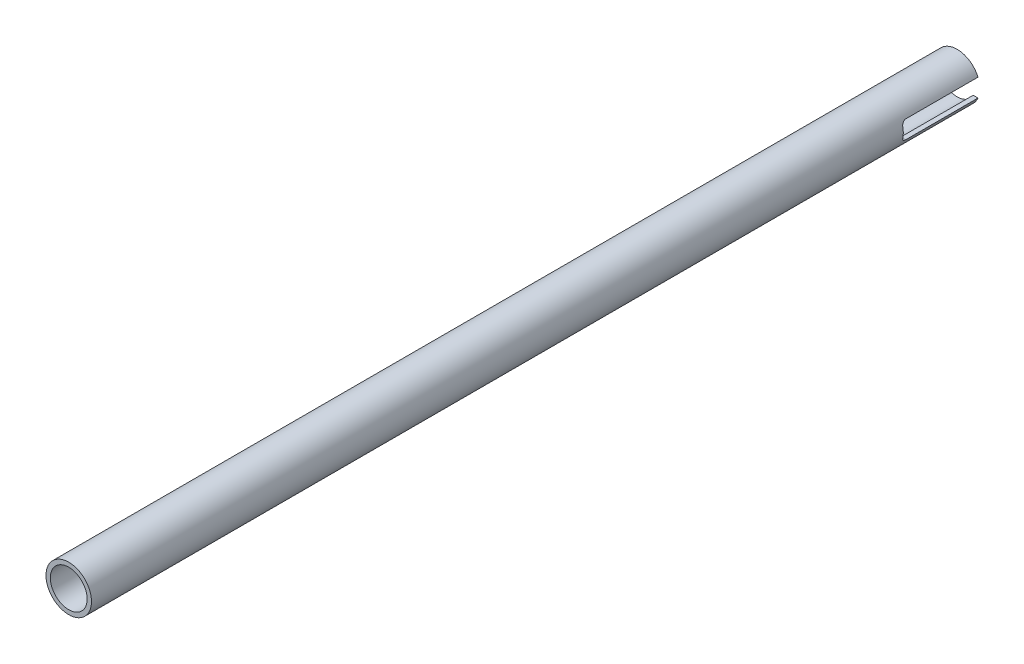
ISO-10303-21;
HEADER;
FILE_DESCRIPTION(('STEP AP214'),'2;1');
FILE_NAME('part.step','',(''),(''),'','','');
FILE_SCHEMA(('AUTOMOTIVE_DESIGN { 1 0 10303 214 1 1 1 1 }'));
ENDSEC;
DATA;
#1=APPLICATION_CONTEXT('core data for automotive mechanical design processes');
#2=APPLICATION_PROTOCOL_DEFINITION('international standard','automotive_design',2000,#1);
#3=PRODUCT_CONTEXT('',#1,'mechanical');
#4=PRODUCT('Part','Part','',(#3));
#5=PRODUCT_RELATED_PRODUCT_CATEGORY('part','',(#4));
#6=PRODUCT_DEFINITION_FORMATION('','',#4);
#7=PRODUCT_DEFINITION_CONTEXT('part definition',#1,'design');
#8=PRODUCT_DEFINITION('design','',#6,#7);
#9=PRODUCT_DEFINITION_SHAPE('','',#8);
#10=(LENGTH_UNIT() NAMED_UNIT(*) SI_UNIT(.MILLI.,.METRE.));
#11=(NAMED_UNIT(*) PLANE_ANGLE_UNIT() SI_UNIT($,.RADIAN.));
#12=(NAMED_UNIT(*) SI_UNIT($,.STERADIAN.) SOLID_ANGLE_UNIT());
#13=UNCERTAINTY_MEASURE_WITH_UNIT(LENGTH_MEASURE(1.E-05),#10,'distance_accuracy_value','');
#14=(GEOMETRIC_REPRESENTATION_CONTEXT(3) GLOBAL_UNCERTAINTY_ASSIGNED_CONTEXT((#13)) GLOBAL_UNIT_ASSIGNED_CONTEXT((#10,
#11,#12)) REPRESENTATION_CONTEXT('',''));
#15=CARTESIAN_POINT('',(0.,0.,0.));
#16=DIRECTION('',(0.,0.,1.));
#17=DIRECTION('',(1.,0.,0.));
#18=AXIS2_PLACEMENT_3D('',#15,#16,#17);
#19=CARTESIAN_POINT('',(0.,0.,0.));
#20=DIRECTION('',(0.,0.,1.));
#21=DIRECTION('',(1.,0.,0.));
#22=AXIS2_PLACEMENT_3D('',#19,#20,#21);
#23=PLANE('',#22);
#24=DIRECTION('',(-1.,0.,0.));
#25=VECTOR('',#24,1.);
#26=CARTESIAN_POINT('',(401.54942792642,-3.17499999999996,2.22044604925031E-13));
#27=LINE('',#26,#25);
#28=CARTESIAN_POINT('',(7.34407080575886,-3.17499999999999,-1.11022302462516E-13));
#29=VERTEX_POINT('',#28);
#30=CARTESIAN_POINT('',(5.64543213580677,-3.175,-1.11022302462516E-13));
#31=VERTEX_POINT('',#30);
#32=EDGE_CURVE('E63',#29,#31,#27,.T.);
#33=ORIENTED_EDGE('',*,*,#32,.F.);
#34=CARTESIAN_POINT('',(0.,0.,0.));
#35=DIRECTION('',(0.,0.,1.));
#36=DIRECTION('',(1.,0.,0.));
#37=AXIS2_PLACEMENT_3D('',#34,#35,#36);
#38=CIRCLE('',#37,8.001);
#39=CARTESIAN_POINT('',(-7.34407080575886,-3.17499999999997,2.22044604925031E-13));
#40=VERTEX_POINT('',#39);
#41=EDGE_CURVE('E154',#40,#29,#38,.T.);
#42=ORIENTED_EDGE('',*,*,#41,.F.);
#43=CARTESIAN_POINT('',(-5.64543213580683,-3.17499999999997,1.11022302462516E-13));
#44=VERTEX_POINT('',#43);
#45=EDGE_CURVE('E148',#44,#40,#27,.T.);
#46=ORIENTED_EDGE('',*,*,#45,.F.);
#47=CARTESIAN_POINT('',(0.,0.,0.));
#48=DIRECTION('',(0.,0.,1.));
#49=DIRECTION('',(1.,0.,0.));
#50=AXIS2_PLACEMENT_3D('',#47,#48,#49);
#51=CIRCLE('',#50,6.477);
#52=EDGE_CURVE('E260',#44,#31,#51,.T.);
#53=ORIENTED_EDGE('',*,*,#52,.T.);
#54=EDGE_LOOP('',(#33,#42,#46,#53));
#55=FACE_BOUND('',#54,.T.);
#56=ADVANCED_FACE('F38',(#55),#23,.F.);
#57=CARTESIAN_POINT('',(0.,0.,312.42));
#58=DIRECTION('',(0.,0.,-1.));
#59=DIRECTION('',(-1.,0.,0.));
#60=AXIS2_PLACEMENT_3D('',#57,#58,#59);
#61=CYLINDRICAL_SURFACE('',#60,8.001);
#62=CARTESIAN_POINT('',(0.,0.,312.42));
#63=DIRECTION('',(0.,0.,1.));
#64=DIRECTION('',(1.,0.,0.));
#65=AXIS2_PLACEMENT_3D('',#62,#63,#64);
#66=CIRCLE('',#65,8.001);
#67=CARTESIAN_POINT('',(8.00099999999998,0.,312.42));
#68=VERTEX_POINT('',#67);
#69=EDGE_CURVE('E269',#68,#68,#66,.T.);
#70=ORIENTED_EDGE('',*,*,#69,.F.);
#71=EDGE_LOOP('',(#70));
#72=FACE_BOUND('',#71,.T.);
#73=DIRECTION('',(0.,0.,-1.));
#74=VECTOR('',#73,1.);
#75=CARTESIAN_POINT('',(7.344070805759,3.17499999999991,312.42));
#76=LINE('',#75,#74);
#77=CARTESIAN_POINT('',(7.34407080575894,3.17500000000001,0.));
#78=VERTEX_POINT('',#77);
#79=CARTESIAN_POINT('',(7.34407080575884,3.17500000000001,25.4000000000001));
#80=VERTEX_POINT('',#79);
#81=EDGE_CURVE('E254',#78,#80,#76,.F.);
#82=ORIENTED_EDGE('',*,*,#81,.F.);
#83=CARTESIAN_POINT('',(-7.34407080575901,3.17500000000003,1.11022302462516E-13));
#84=VERTEX_POINT('',#83);
#85=EDGE_CURVE('E274',#78,#84,#38,.T.);
#86=ORIENTED_EDGE('',*,*,#85,.T.);
#87=DIRECTION('',(0.,0.,-1.));
#88=VECTOR('',#87,1.);
#89=CARTESIAN_POINT('',(-7.34407080575899,3.17499999999992,312.42));
#90=LINE('',#89,#88);
#91=CARTESIAN_POINT('',(-7.34407080575895,3.17499999999999,25.4000000000001));
#92=VERTEX_POINT('',#91);
#93=EDGE_CURVE('E257',#92,#84,#90,.T.);
#94=ORIENTED_EDGE('',*,*,#93,.F.);
#95=CARTESIAN_POINT('',(-7.82880578377058,1.65099999999997,26.9240000000001));
#96=CARTESIAN_POINT('',(-7.81947795268344,1.69524181564514,26.9239996807891));
#97=CARTESIAN_POINT('',(-7.80977555287386,1.73937906238706,26.9220725755958));
#98=CARTESIAN_POINT('',(-7.7897053190962,1.82715995012298,26.9144259194226));
#99=CARTESIAN_POINT('',(-7.77933765259943,1.87080371211605,26.9087073195402));
#100=CARTESIAN_POINT('',(-7.74740781787862,2.00038689143382,26.885992083217));
#101=CARTESIAN_POINT('',(-7.72497172734662,2.08520038066884,26.8634353611243));
#102=CARTESIAN_POINT('',(-7.67879255624771,2.24931803273245,26.8043529357356));
#103=CARTESIAN_POINT('',(-7.65505009243314,2.32862475603228,26.7678337766223));
#104=CARTESIAN_POINT('',(-7.60739952527333,2.47987144136623,26.6818403935316));
#105=CARTESIAN_POINT('',(-7.58349136309821,2.55180862700727,26.6323613118313));
#106=CARTESIAN_POINT('',(-7.53640113822512,2.6877387711248,26.5205553900399));
#107=CARTESIAN_POINT('',(-7.51324222932273,2.75155008701088,26.4579974672166));
#108=CARTESIAN_POINT('',(-7.46969556535494,2.86766507697734,26.3221080561484));
#109=CARTESIAN_POINT('',(-7.44930787514763,2.91996848174227,26.2487763158346));
#110=CARTESIAN_POINT('',(-7.41339882631973,3.00995182097469,26.095356056821));
#111=CARTESIAN_POINT('',(-7.39775949227142,3.04799299625055,26.015507568052));
#112=CARTESIAN_POINT('',(-7.37198636942662,3.10981595853772,25.849696312684));
#113=CARTESIAN_POINT('',(-7.36184321814923,3.13362200161645,25.7637442276388));
#114=CARTESIAN_POINT('',(-7.35134082404797,3.15814271182933,25.630748149592));
#115=CARTESIAN_POINT('',(-7.34862226710172,3.16445643648466,25.5848527548859));
#116=CARTESIAN_POINT('',(-7.34498545577233,3.17288497032071,25.4926477775769));
#117=CARTESIAN_POINT('',(-7.34406565426137,3.17500338794755,25.4463385853612));
#118=CARTESIAN_POINT('',(-7.34407080575895,3.17499999999999,25.4000000000001));
#119=B_SPLINE_CURVE_WITH_KNOTS('',3,(#95,#96,#97,#98,#99,#100,#101,#102,#103,#104,#105,#106,
#107,#108,#109,#110,#111,#112,#113,#114,#115,#116,#117,#118),.UNSPECIFIED.,.F.,.F.,(4,2,2,2,2,2,
2,2,2,2,2,4),(0.,0.135553024626291,0.271072058592407,0.541437670458045,0.811676717226745,
1.08201720207605,1.35761362878693,1.63321650449513,1.90127196271379,2.1688693543926,
2.30789050122087,2.44679202186563),.UNSPECIFIED.);
#120=CARTESIAN_POINT('',(-7.82880578377058,1.65099999999997,26.9240000000001));
#121=VERTEX_POINT('',#120);
#122=EDGE_CURVE('E240',#121,#92,#119,.T.);
#123=ORIENTED_EDGE('',*,*,#122,.F.);
#124=CARTESIAN_POINT('',(0.,0.,26.9240000000001));
#125=DIRECTION('',(0.,0.,-1.));
#126=DIRECTION('',(-1.,0.,0.));
#127=AXIS2_PLACEMENT_3D('',#124,#125,#126);
#128=CIRCLE('',#127,8.001);
#129=CARTESIAN_POINT('',(-7.82880578377065,-1.651,26.9239999999999));
#130=VERTEX_POINT('',#129);
#131=EDGE_CURVE('E141',#130,#121,#128,.T.);
#132=ORIENTED_EDGE('',*,*,#131,.F.);
#133=CARTESIAN_POINT('',(-7.34407080575888,-3.17500000000003,25.4));
#134=CARTESIAN_POINT('',(-7.3440680096913,-3.17500157818637,25.4406984476088));
#135=CARTESIAN_POINT('',(-7.34477630214678,-3.17336860893185,25.4813759502432));
#136=CARTESIAN_POINT('',(-7.34758309143994,-3.16686635956909,25.562411407968));
#137=CARTESIAN_POINT('',(-7.34968118035479,-3.16199802907893,25.6027694533067));
#138=CARTESIAN_POINT('',(-7.35798857580184,-3.14264423927032,25.7226338560667));
#139=CARTESIAN_POINT('',(-7.36621159330717,-3.12340930879258,25.8012906881812));
#140=CARTESIAN_POINT('',(-7.38735918413181,-3.07305366060583,25.9538993996992));
#141=CARTESIAN_POINT('',(-7.40028060607284,-3.04194090905525,26.0278543938131));
#142=CARTESIAN_POINT('',(-7.4298815779994,-2.96890708335135,26.169445343595));
#143=CARTESIAN_POINT('',(-7.4465637265046,-2.92697853298675,26.2370768840648));
#144=CARTESIAN_POINT('',(-7.48338951433543,-2.8315372751441,26.3673193992746));
#145=CARTESIAN_POINT('',(-7.5036517696014,-2.77760154335602,26.4295861247468));
#146=CARTESIAN_POINT('',(-7.54586923311688,-2.66077336101828,26.5443978381578));
#147=CARTESIAN_POINT('',(-7.56782510086075,-2.59787741319579,26.5969390116059));
#148=CARTESIAN_POINT('',(-7.61377353576088,-2.46009532987574,26.6944249056502));
#149=CARTESIAN_POINT('',(-7.63780327629239,-2.38468542927399,26.7386132632461));
#150=CARTESIAN_POINT('',(-7.68517828309943,-2.22728162943214,26.8135295949975));
#151=CARTESIAN_POINT('',(-7.70852388215326,-2.14529100625114,26.844264218198));
#152=CARTESIAN_POINT('',(-7.74866065435348,-1.99473307846589,26.8863269168586));
#153=CARTESIAN_POINT('',(-7.76579152458539,-1.92700882203661,26.9003889784846));
#154=CARTESIAN_POINT('',(-7.79853598216447,-1.78994063052704,26.9192336722559));
#155=CARTESIAN_POINT('',(-7.81414985826825,-1.72059700681912,26.924018073684));
#156=CARTESIAN_POINT('',(-7.82880578377065,-1.651,26.9239999999999));
#157=B_SPLINE_CURVE_WITH_KNOTS('',3,(#133,#134,#135,#136,#137,#138,#139,#140,#141,#142,#143,
#144,#145,#146,#147,#148,#149,#150,#151,#152,#153,#154,#155,#156),.UNSPECIFIED.,.F.,.F.,(4,2,2,
2,2,2,2,2,2,2,2,4),(0.,0.122015614312949,0.243995431359566,0.486888996424044,0.729619944201884,
0.972519126749266,1.22593711832613,1.47945429417225,1.75015649231419,2.02072475374976,
2.2338843332116,2.44700325838144),.UNSPECIFIED.);
#158=CARTESIAN_POINT('',(-7.34407080575888,-3.17500000000003,25.4));
#159=VERTEX_POINT('',#158);
#160=EDGE_CURVE('E142',#159,#130,#157,.T.);
#161=ORIENTED_EDGE('',*,*,#160,.F.);
#162=DIRECTION('',(0.,0.,-1.));
#163=VECTOR('',#162,1.);
#164=CARTESIAN_POINT('',(-7.34407080575887,-3.17499999999998,312.42));
#165=LINE('',#164,#163);
#166=EDGE_CURVE('E156',#40,#159,#165,.F.);
#167=ORIENTED_EDGE('',*,*,#166,.F.);
#168=ORIENTED_EDGE('',*,*,#41,.T.);
#169=DIRECTION('',(0.,0.,-1.));
#170=VECTOR('',#169,1.);
#171=CARTESIAN_POINT('',(7.3440708057589,-3.175,312.42));
#172=LINE('',#171,#170);
#173=CARTESIAN_POINT('',(7.34407080575886,-3.17499999999998,25.4000000000002));
#174=VERTEX_POINT('',#173);
#175=EDGE_CURVE('E145',#174,#29,#172,.T.);
#176=ORIENTED_EDGE('',*,*,#175,.F.);
#177=CARTESIAN_POINT('',(7.82880578377054,-1.65099999999999,26.9240000000001));
#178=CARTESIAN_POINT('',(7.81947795268341,-1.69524181564515,26.923999680789));
#179=CARTESIAN_POINT('',(7.80977555287385,-1.73937906238704,26.9220725755956));
#180=CARTESIAN_POINT('',(7.7897053190962,-1.82715995012294,26.9144259194223));
#181=CARTESIAN_POINT('',(7.77933765259943,-1.870803712116,26.90870731954));
#182=CARTESIAN_POINT('',(7.7474078178786,-2.0003868914338,26.8859920832169));
#183=CARTESIAN_POINT('',(7.72497172734655,-2.08520038066888,26.8634353611244));
#184=CARTESIAN_POINT('',(7.67879255624767,-2.24931803273244,26.8043529357357));
#185=CARTESIAN_POINT('',(7.65505009243316,-2.32862475603214,26.7678337766221));
#186=CARTESIAN_POINT('',(7.60739952527336,-2.47987144136612,26.6818403935314));
#187=CARTESIAN_POINT('',(7.58349136309817,-2.55180862700729,26.6323613118314));
#188=CARTESIAN_POINT('',(7.53640113822508,-2.68773877112481,26.52055539004));
#189=CARTESIAN_POINT('',(7.51324222932275,-2.75155008701072,26.4579974672165));
#190=CARTESIAN_POINT('',(7.469695565355,-2.8676650769772,26.3221080561482));
#191=CARTESIAN_POINT('',(7.44930787514769,-2.91996848174229,26.2487763158346));
#192=CARTESIAN_POINT('',(7.41339882631977,-3.00995182097471,26.095356056821));
#193=CARTESIAN_POINT('',(7.39775949227146,-3.04799299625041,26.015507568052));
#194=CARTESIAN_POINT('',(7.37198636942665,-3.10981595853761,25.849696312684));
#195=CARTESIAN_POINT('',(7.36184321814925,-3.13362200161652,25.7637442276389));
#196=CARTESIAN_POINT('',(7.351340824048,-3.15814271182936,25.6307481495922));
#197=CARTESIAN_POINT('',(7.34862226710175,-3.16445643648462,25.584852754886));
#198=CARTESIAN_POINT('',(7.34498545577234,-3.1728849703206,25.492647777577));
#199=CARTESIAN_POINT('',(7.34406565426135,-3.17500338794743,25.4463385853613));
#200=CARTESIAN_POINT('',(7.34407080575886,-3.17499999999998,25.4000000000002));
#201=B_SPLINE_CURVE_WITH_KNOTS('',3,(#177,#178,#179,#180,#181,#182,#183,#184,#185,#186,#187,
#188,#189,#190,#191,#192,#193,#194,#195,#196,#197,#198,#199,#200),.UNSPECIFIED.,.F.,.F.,(4,2,2,
2,2,2,2,2,2,2,2,4),(0.,0.135553024626226,0.271072058592359,0.541437670457965,0.811676717226635,
1.08201720207591,1.3576136287868,1.63321650449503,1.90127196271362,2.16886935439237,
2.30789050122063,2.44679202186539),.UNSPECIFIED.);
#202=CARTESIAN_POINT('',(7.82880578377054,-1.65099999999999,26.9240000000001));
#203=VERTEX_POINT('',#202);
#204=EDGE_CURVE('E130',#203,#174,#201,.T.);
#205=ORIENTED_EDGE('',*,*,#204,.F.);
#206=CARTESIAN_POINT('',(7.82880578377061,1.65099999999998,26.9240000000001));
#207=VERTEX_POINT('',#206);
#208=EDGE_CURVE('E247',#207,#203,#128,.T.);
#209=ORIENTED_EDGE('',*,*,#208,.F.);
#210=CARTESIAN_POINT('',(7.34407080575884,3.17500000000001,25.4000000000001));
#211=CARTESIAN_POINT('',(7.34406800969128,3.17500157818639,25.4406984476089));
#212=CARTESIAN_POINT('',(7.34477630214676,3.17336860893189,25.4813759502434));
#213=CARTESIAN_POINT('',(7.34758309143992,3.16686635956916,25.5624114079681));
#214=CARTESIAN_POINT('',(7.34968118035476,3.161998029079,25.6027694533068));
#215=CARTESIAN_POINT('',(7.35798857580181,3.14264423927036,25.7226338560668));
#216=CARTESIAN_POINT('',(7.36621159330713,3.12340930879257,25.8012906881813));
#217=CARTESIAN_POINT('',(7.38735918413177,3.07305366060585,25.9538993996993));
#218=CARTESIAN_POINT('',(7.4002806060728,3.04194090905536,26.0278543938132));
#219=CARTESIAN_POINT('',(7.42988157799935,2.96890708335145,26.1694453435951));
#220=CARTESIAN_POINT('',(7.44656372650453,2.92697853298674,26.2370768840648));
#221=CARTESIAN_POINT('',(7.48338951433536,2.83153727514407,26.3673193992747));
#222=CARTESIAN_POINT('',(7.50365176960136,2.77760154335609,26.429586124747));
#223=CARTESIAN_POINT('',(7.54586923311686,2.66077336101838,26.5443978381581));
#224=CARTESIAN_POINT('',(7.56782510086072,2.59787741319583,26.5969390116061));
#225=CARTESIAN_POINT('',(7.61377353576086,2.46009532987573,26.6944249056504));
#226=CARTESIAN_POINT('',(7.63780327629238,2.384685429274,26.7386132632464));
#227=CARTESIAN_POINT('',(7.68517828309943,2.22728162943215,26.8135295949977));
#228=CARTESIAN_POINT('',(7.70852388215323,2.14529100625113,26.8442642181982));
#229=CARTESIAN_POINT('',(7.74866065435346,1.99473307846587,26.8863269168588));
#230=CARTESIAN_POINT('',(7.76579152458538,1.9270088220366,26.9003889784848));
#231=CARTESIAN_POINT('',(7.79853598216447,1.78994063052704,26.9192336722561));
#232=CARTESIAN_POINT('',(7.81414985826824,1.72059700681911,26.9240180736842));
#233=CARTESIAN_POINT('',(7.82880578377061,1.65099999999998,26.9240000000001));
#234=B_SPLINE_CURVE_WITH_KNOTS('',3,(#210,#211,#212,#213,#214,#215,#216,#217,#218,#219,#220,
#221,#222,#223,#224,#225,#226,#227,#228,#229,#230,#231,#232,#233),.UNSPECIFIED.,.F.,.F.,(4,2,2,
2,2,2,2,2,2,2,2,4),(0.,0.122015614312971,0.243995431359583,0.486888996424055,0.729619944201842,
0.97251912674919,1.22593711832615,1.47945429417235,1.7501564923143,2.02072475374989,
2.23388433321172,2.44700325838156),.UNSPECIFIED.);
#235=EDGE_CURVE('E246',#80,#207,#234,.T.);
#236=ORIENTED_EDGE('',*,*,#235,.F.);
#237=EDGE_LOOP('',(#82,#86,#94,#123,#132,#161,#167,#168,#176,#205,#209,#236));
#238=FACE_BOUND('',#237,.T.);
#239=ADVANCED_FACE('F40',(#72,#238),#61,.T.);
#240=CARTESIAN_POINT('',(0.,0.,312.42));
#241=DIRECTION('',(0.,0.,-1.));
#242=DIRECTION('',(-1.,0.,0.));
#243=AXIS2_PLACEMENT_3D('',#240,#241,#242);
#244=CYLINDRICAL_SURFACE('',#243,6.477);
#245=CARTESIAN_POINT('',(0.,0.,312.42));
#246=DIRECTION('',(0.,0.,1.));
#247=DIRECTION('',(1.,0.,0.));
#248=AXIS2_PLACEMENT_3D('',#245,#246,#247);
#249=CIRCLE('',#248,6.477);
#250=CARTESIAN_POINT('',(6.47699999999998,0.,312.42));
#251=VERTEX_POINT('',#250);
#252=EDGE_CURVE('E261',#251,#251,#249,.T.);
#253=ORIENTED_EDGE('',*,*,#252,.T.);
#254=EDGE_LOOP('',(#253));
#255=FACE_BOUND('',#254,.T.);
#256=CARTESIAN_POINT('',(5.64543213580689,3.17500000000003,-1.11022302462516E-13));
#257=VERTEX_POINT('',#256);
#258=CARTESIAN_POINT('',(-5.64543213580689,3.17500000000005,-1.11022302462516E-13));
#259=VERTEX_POINT('',#258);
#260=EDGE_CURVE('E265',#257,#259,#51,.T.);
#261=ORIENTED_EDGE('',*,*,#260,.F.);
#262=DIRECTION('',(0.,0.,-1.));
#263=VECTOR('',#262,1.);
#264=CARTESIAN_POINT('',(5.64543213580686,3.17499999999992,312.42));
#265=LINE('',#264,#263);
#266=CARTESIAN_POINT('',(5.64543213580677,3.17500000000002,25.4000000000002));
#267=VERTEX_POINT('',#266);
#268=EDGE_CURVE('E11',#257,#267,#265,.F.);
#269=ORIENTED_EDGE('',*,*,#268,.T.);
#270=CARTESIAN_POINT('',(5.64543213580677,3.17500000000002,25.4000000000002));
#271=CARTESIAN_POINT('',(5.64542798532431,3.17500253012493,25.4395022750386));
#272=CARTESIAN_POINT('',(5.64629676751121,3.17346305780191,25.4789831851799));
#273=CARTESIAN_POINT('',(5.6497348917276,3.16734010596938,25.5576163338372));
#274=CARTESIAN_POINT('',(5.6523034721619,3.16275798971438,25.5967687115999));
#275=CARTESIAN_POINT('',(5.66245282356228,3.14457608288723,25.7129070155874));
#276=CARTESIAN_POINT('',(5.67247830845163,3.12653965087181,25.7890381879893));
#277=CARTESIAN_POINT('',(5.69814957474153,3.0795007596576,25.9366255007952));
#278=CARTESIAN_POINT('',(5.71378770060097,3.05051323473291,26.0080878532048));
#279=CARTESIAN_POINT('',(5.74949312759981,2.98267072120724,26.1450337996202));
#280=CARTESIAN_POINT('',(5.76956543427934,2.94380457356394,26.2105105176722));
#281=CARTESIAN_POINT('',(5.81427344287332,2.8545402048413,26.3383725064171));
#282=CARTESIAN_POINT('',(5.83912294015502,2.8035500131349,26.4002682413204));
#283=CARTESIAN_POINT('',(5.89090094280734,2.69305400468496,26.5149190340716));
#284=CARTESIAN_POINT('',(5.91783040535227,2.63354425646506,26.567669846873));
#285=CARTESIAN_POINT('',(5.97540269204172,2.50037980782338,26.6683991647786));
#286=CARTESIAN_POINT('',(6.00613015030673,2.42589024924436,26.7152294493508));
#287=CARTESIAN_POINT('',(6.06685054178965,2.26977298542606,26.7954912659986));
#288=CARTESIAN_POINT('',(6.09684379767182,2.18814849062357,26.8289287868609));
#289=CARTESIAN_POINT('',(6.15068954263712,2.03135452128191,26.8777262918859));
#290=CARTESIAN_POINT('',(6.17481721444705,1.95685658409071,26.8949485076859));
#291=CARTESIAN_POINT('',(6.22080900465627,1.8053989658326,26.9181012531518));
#292=CARTESIAN_POINT('',(6.2426715488463,1.72843762073715,26.9240239790677));
#293=CARTESIAN_POINT('',(6.26304462701646,1.65100000000001,26.9240000000001));
#294=B_SPLINE_CURVE_WITH_KNOTS('',3,(#270,#271,#272,#273,#274,#275,#276,#277,#278,#279,#280,
#281,#282,#283,#284,#285,#286,#287,#288,#289,#290,#291,#292,#293),.UNSPECIFIED.,.F.,.F.,(4,2,2,
2,2,2,2,2,2,2,2,4),(0.,0.118426117882539,0.236799210795214,0.472172634307135,0.707226225251937,
0.942546525606632,1.19340365391785,1.44437691938371,1.72272641785943,2.00095130860672,
2.24064521780663,2.4805046066162),.UNSPECIFIED.);
#295=CARTESIAN_POINT('',(6.26304462701646,1.65100000000001,26.9240000000001));
#296=VERTEX_POINT('',#295);
#297=EDGE_CURVE('E48',#267,#296,#294,.T.);
#298=ORIENTED_EDGE('',*,*,#297,.T.);
#299=CARTESIAN_POINT('',(0.,0.,26.9240000000001));
#300=DIRECTION('',(0.,0.,-1.));
#301=DIRECTION('',(-1.,0.,0.));
#302=AXIS2_PLACEMENT_3D('',#299,#300,#301);
#303=CIRCLE('',#302,6.477);
#304=CARTESIAN_POINT('',(6.26304462701648,-1.65100000000001,26.9240000000003));
#305=VERTEX_POINT('',#304);
#306=EDGE_CURVE('E202',#296,#305,#303,.T.);
#307=ORIENTED_EDGE('',*,*,#306,.T.);
#308=CARTESIAN_POINT('',(6.26304462701648,-1.65100000000001,26.9240000000003));
#309=CARTESIAN_POINT('',(6.25119301356599,-1.69597019045451,26.9239996512928));
#310=CARTESIAN_POINT('',(6.23885805015263,-1.74078424361483,26.9220087653987));
#311=CARTESIAN_POINT('',(6.21333080831812,-1.82980515275705,26.9141341389411));
#312=CARTESIAN_POINT('',(6.20013884930388,-1.87401222760584,26.9082518413062));
#313=CARTESIAN_POINT('',(6.15951133396886,-2.00506101361783,26.8849457970163));
#314=CARTESIAN_POINT('',(6.13094979172369,-2.09061085165533,26.8618617467996));
#315=CARTESIAN_POINT('',(6.07212151471614,-2.25578612168243,26.8016219603262));
#316=CARTESIAN_POINT('',(6.04185654214357,-2.33541748531395,26.7644805465843));
#317=CARTESIAN_POINT('',(5.98100165398779,-2.48713337520258,26.6771532445205));
#318=CARTESIAN_POINT('',(5.95041151302891,-2.55921223237764,26.6269576544589));
#319=CARTESIAN_POINT('',(5.88959770370064,-2.69629003214928,26.5127307014112));
#320=CARTESIAN_POINT('',(5.8594202610873,-2.76097278644594,26.4482938275107));
#321=CARTESIAN_POINT('',(5.80262181829035,-2.87843237174363,26.3079375307773));
#322=CARTESIAN_POINT('',(5.77600068690933,-2.93120964200447,26.2320185317568));
#323=CARTESIAN_POINT('',(5.72961508062246,-3.02084256755073,26.0738173863489));
#324=CARTESIAN_POINT('',(5.70961192114587,-3.05826802843452,25.9919300118511));
#325=CARTESIAN_POINT('',(5.67705818777083,-3.11828924116529,25.8215909438743));
#326=CARTESIAN_POINT('',(5.66448853762428,-3.14092296814996,25.7331567140416));
#327=CARTESIAN_POINT('',(5.65274801817811,-3.1619637560802,25.6030428647808));
#328=CARTESIAN_POINT('',(5.65001234622035,-3.1668452606436,25.562631347603));
#329=CARTESIAN_POINT('',(5.64635324825545,-3.17336296637711,25.4814890576694));
#330=CARTESIAN_POINT('',(5.64542881846815,-3.17500096508514,25.4407584743121));
#331=CARTESIAN_POINT('',(5.64543213580676,-3.175,25.4000000000001));
#332=B_SPLINE_CURVE_WITH_KNOTS('',3,(#308,#309,#310,#311,#312,#313,#314,#315,#316,#317,#318,
#319,#320,#321,#322,#323,#324,#325,#326,#327,#328,#329,#330,#331),.UNSPECIFIED.,.F.,.F.,(4,2,2,
2,2,2,2,2,2,2,2,4),(0.,0.139419976741783,0.278788285754541,0.556665652257237,0.834260658887733,
1.11206256399926,1.3991269523371,1.68618074753327,1.96132294859877,2.2357559669014,
2.3580017656901,2.48017979736533),.UNSPECIFIED.);
#333=CARTESIAN_POINT('',(5.64543213580672,-3.17499999999998,25.4000000000002));
#334=VERTEX_POINT('',#333);
#335=EDGE_CURVE('E195',#305,#334,#332,.T.);
#336=ORIENTED_EDGE('',*,*,#335,.T.);
#337=DIRECTION('',(0.,0.,-1.));
#338=VECTOR('',#337,1.);
#339=CARTESIAN_POINT('',(5.6454321358068,-3.17499999999998,312.42));
#340=LINE('',#339,#338);
#341=EDGE_CURVE('E146',#334,#31,#340,.T.);
#342=ORIENTED_EDGE('',*,*,#341,.T.);
#343=ORIENTED_EDGE('',*,*,#52,.F.);
#344=DIRECTION('',(0.,0.,-1.));
#345=VECTOR('',#344,1.);
#346=CARTESIAN_POINT('',(-5.64543213580676,-3.17499999999999,312.42));
#347=LINE('',#346,#345);
#348=CARTESIAN_POINT('',(-5.64543213580678,-3.17500000000002,25.4000000000001));
#349=VERTEX_POINT('',#348);
#350=EDGE_CURVE('E273',#44,#349,#347,.F.);
#351=ORIENTED_EDGE('',*,*,#350,.T.);
#352=CARTESIAN_POINT('',(-5.64543213580678,-3.17500000000001,25.4000000000001));
#353=CARTESIAN_POINT('',(-5.64542798532433,-3.17500253012491,25.4395022750385));
#354=CARTESIAN_POINT('',(-5.64629676751124,-3.17346305780187,25.4789831851798));
#355=CARTESIAN_POINT('',(-5.64973489172764,-3.1673401059693,25.5576163338371));
#356=CARTESIAN_POINT('',(-5.65230347216194,-3.16275798971429,25.5967687115999));
#357=CARTESIAN_POINT('',(-5.66245282356233,-3.14457608288717,25.7129070155874));
#358=CARTESIAN_POINT('',(-5.67247830845168,-3.12653965087185,25.7890381879894));
#359=CARTESIAN_POINT('',(-5.6981495747416,-3.07950075965758,25.9366255007953));
#360=CARTESIAN_POINT('',(-5.71378770060108,-3.05051323473275,26.0080878532048));
#361=CARTESIAN_POINT('',(-5.74949312759987,-2.98267072120707,26.1450337996202));
#362=CARTESIAN_POINT('',(-5.76956543427932,-2.94380457356393,26.2105105176723));
#363=CARTESIAN_POINT('',(-5.81427344287331,-2.85454020484129,26.3383725064171));
#364=CARTESIAN_POINT('',(-5.83912294015509,-2.80355001313473,26.4002682413202));
#365=CARTESIAN_POINT('',(-5.89090094280743,-2.69305400468479,26.5149190340715));
#366=CARTESIAN_POINT('',(-5.9178304053523,-2.63354425646506,26.5676698468731));
#367=CARTESIAN_POINT('',(-5.97540269204173,-2.50037980782343,26.6683991647787));
#368=CARTESIAN_POINT('',(-6.00613015030679,-2.42589024924426,26.7152294493507));
#369=CARTESIAN_POINT('',(-6.06685054178969,-2.26977298542594,26.7954912659984));
#370=CARTESIAN_POINT('',(-6.09684379767179,-2.18814849062356,26.828928786861));
#371=CARTESIAN_POINT('',(-6.15068954263707,-2.03135452128195,26.877726291886));
#372=CARTESIAN_POINT('',(-6.17481721444704,-1.95685658409072,26.8949485076858));
#373=CARTESIAN_POINT('',(-6.2208090046563,-1.80539896583254,26.9181012531514));
#374=CARTESIAN_POINT('',(-6.24267154884636,-1.72843762073707,26.9240239790673));
#375=CARTESIAN_POINT('',(-6.26304462701648,-1.65100000000001,26.9240000000001));
#376=B_SPLINE_CURVE_WITH_KNOTS('',3,(#352,#353,#354,#355,#356,#357,#358,#359,#360,#361,#362,
#363,#364,#365,#366,#367,#368,#369,#370,#371,#372,#373,#374,#375),.UNSPECIFIED.,.F.,.F.,(4,2,2,
2,2,2,2,2,2,2,2,4),(0.,0.118426117882566,0.236799210795309,0.47217263430734,0.707226225252122,
0.942546525606795,1.19340365391799,1.44437691938382,1.72272641785951,2.00095130860675,
2.24064521780666,2.48050460661622),.UNSPECIFIED.);
#377=CARTESIAN_POINT('',(-6.26304462701648,-1.65100000000001,26.9240000000001));
#378=VERTEX_POINT('',#377);
#379=EDGE_CURVE('E185',#349,#378,#376,.T.);
#380=ORIENTED_EDGE('',*,*,#379,.T.);
#381=CARTESIAN_POINT('',(-6.26304462701647,1.65100000000001,26.9240000000002));
#382=VERTEX_POINT('',#381);
#383=EDGE_CURVE('E228',#378,#382,#303,.T.);
#384=ORIENTED_EDGE('',*,*,#383,.T.);
#385=CARTESIAN_POINT('',(-6.26304462701647,1.65100000000001,26.9240000000002));
#386=CARTESIAN_POINT('',(-6.25119301356599,1.69597019045453,26.9239996512929));
#387=CARTESIAN_POINT('',(-6.23885805015262,1.74078424361488,26.9220087653989));
#388=CARTESIAN_POINT('',(-6.21333080831812,1.82980515275711,26.9141341389413));
#389=CARTESIAN_POINT('',(-6.20013884930388,1.8740122276059,26.9082518413065));
#390=CARTESIAN_POINT('',(-6.15951133396886,2.00506101361786,26.8849457970165));
#391=CARTESIAN_POINT('',(-6.1309497917237,2.09061085165529,26.8618617467995));
#392=CARTESIAN_POINT('',(-6.07212151471612,2.25578612168242,26.8016219603263));
#393=CARTESIAN_POINT('',(-6.04185654214352,2.33541748531402,26.7644805465845));
#394=CARTESIAN_POINT('',(-5.98100165398781,2.48713337520264,26.6771532445207));
#395=CARTESIAN_POINT('',(-5.95041151302903,2.5592122323776,26.6269576544589));
#396=CARTESIAN_POINT('',(-5.88959770370074,2.69629003214927,26.5127307014112));
#397=CARTESIAN_POINT('',(-5.85942026108729,2.76097278644605,26.4482938275109));
#398=CARTESIAN_POINT('',(-5.80262181829029,2.87843237174374,26.3079375307775));
#399=CARTESIAN_POINT('',(-5.77600068690934,2.93120964200445,26.2320185317568));
#400=CARTESIAN_POINT('',(-5.72961508062247,3.02084256755072,26.0738173863488));
#401=CARTESIAN_POINT('',(-5.7096119211458,3.05826802843463,25.9919300118512));
#402=CARTESIAN_POINT('',(-5.67705818777081,3.11828924116539,25.8215909438744));
#403=CARTESIAN_POINT('',(-5.66448853762438,3.14092296814994,25.7331567140416));
#404=CARTESIAN_POINT('',(-5.65274801817816,3.16196375608021,25.6030428647809));
#405=CARTESIAN_POINT('',(-5.65001234622035,3.16684526064365,25.562631347603));
#406=CARTESIAN_POINT('',(-5.64635324825541,3.17336296637718,25.4814890576695));
#407=CARTESIAN_POINT('',(-5.64542881846813,3.17500096508521,25.4407584743122));
#408=CARTESIAN_POINT('',(-5.64543213580682,3.17499999999999,25.4000000000002));
#409=B_SPLINE_CURVE_WITH_KNOTS('',3,(#385,#386,#387,#388,#389,#390,#391,#392,#393,#394,#395,
#396,#397,#398,#399,#400,#401,#402,#403,#404,#405,#406,#407,#408),.UNSPECIFIED.,.F.,.F.,(4,2,2,
2,2,2,2,2,2,2,2,4),(0.,0.13941997674183,0.278788285754566,0.556665652257261,0.834260658887749,
1.11206256399927,1.39912695233716,1.68618074753337,1.96132294859887,2.23575596690152,
2.35800176569016,2.48017979736535),.UNSPECIFIED.);
#410=CARTESIAN_POINT('',(-5.64543213580682,3.17499999999999,25.4000000000002));
#411=VERTEX_POINT('',#410);
#412=EDGE_CURVE('E220',#382,#411,#409,.T.);
#413=ORIENTED_EDGE('',*,*,#412,.T.);
#414=DIRECTION('',(0.,0.,-1.));
#415=VECTOR('',#414,1.);
#416=CARTESIAN_POINT('',(-5.64543213580684,3.17499999999991,312.42));
#417=LINE('',#416,#415);
#418=EDGE_CURVE('E227',#411,#259,#417,.T.);
#419=ORIENTED_EDGE('',*,*,#418,.T.);
#420=EDGE_LOOP('',(#261,#269,#298,#307,#336,#342,#343,#351,#380,#384,#413,#419));
#421=FACE_BOUND('',#420,.T.);
#422=ADVANCED_FACE('F208',(#255,#421),#244,.F.);
#423=CARTESIAN_POINT('',(0.,0.,312.42));
#424=DIRECTION('',(0.,0.,1.));
#425=DIRECTION('',(1.,0.,0.));
#426=AXIS2_PLACEMENT_3D('',#423,#424,#425);
#427=PLANE('',#426);
#428=ORIENTED_EDGE('',*,*,#69,.T.);
#429=EDGE_LOOP('',(#428));
#430=FACE_BOUND('',#429,.T.);
#431=ORIENTED_EDGE('',*,*,#252,.F.);
#432=EDGE_LOOP('',(#431));
#433=FACE_BOUND('',#432,.T.);
#434=ADVANCED_FACE('F213',(#430,#433),#427,.T.);
#435=ORIENTED_EDGE('',*,*,#85,.F.);
#436=DIRECTION('',(-1.,0.,0.));
#437=VECTOR('',#436,1.);
#438=CARTESIAN_POINT('',(401.54942792642,3.17500000000006,2.22044604925031E-13));
#439=LINE('',#438,#437);
#440=EDGE_CURVE('E162',#78,#257,#439,.T.);
#441=ORIENTED_EDGE('',*,*,#440,.T.);
#442=ORIENTED_EDGE('',*,*,#260,.T.);
#443=EDGE_CURVE('E305',#259,#84,#439,.T.);
#444=ORIENTED_EDGE('',*,*,#443,.T.);
#445=EDGE_LOOP('',(#435,#441,#442,#444));
#446=FACE_BOUND('',#445,.T.);
#447=ADVANCED_FACE('F354',(#446),#23,.F.);
#448=CARTESIAN_POINT('',(401.54942792642,-3.17499999999993,25.4000000000001));
#449=DIRECTION('',(0.,1.,0.));
#450=DIRECTION('',(0.,0.,1.));
#451=AXIS2_PLACEMENT_3D('',#448,#449,#450);
#452=PLANE('',#451);
#453=ORIENTED_EDGE('',*,*,#45,.T.);
#454=ORIENTED_EDGE('',*,*,#166,.T.);
#455=DIRECTION('',(-1.,0.,0.));
#456=VECTOR('',#455,1.);
#457=CARTESIAN_POINT('',(401.54942792642,-3.17499999999993,25.4000000000001));
#458=LINE('',#457,#456);
#459=EDGE_CURVE('E55',#349,#159,#458,.T.);
#460=ORIENTED_EDGE('',*,*,#459,.F.);
#461=ORIENTED_EDGE('',*,*,#350,.F.);
#462=EDGE_LOOP('',(#453,#454,#460,#461));
#463=FACE_BOUND('',#462,.T.);
#464=ADVANCED_FACE('F379',(#463),#452,.T.);
#465=CARTESIAN_POINT('',(401.549427926421,-1.65099999999992,25.4000000000001));
#466=DIRECTION('',(-1.,0.,0.));
#467=DIRECTION('',(0.,0.,1.));
#468=AXIS2_PLACEMENT_3D('',#465,#466,#467);
#469=CYLINDRICAL_SURFACE('',#468,1.524);
#470=ORIENTED_EDGE('',*,*,#459,.T.);
#471=ORIENTED_EDGE('',*,*,#160,.T.);
#472=DIRECTION('',(-1.,0.,0.));
#473=VECTOR('',#472,1.);
#474=CARTESIAN_POINT('',(401.549427926421,-1.65099999999993,26.9240000000001));
#475=LINE('',#474,#473);
#476=EDGE_CURVE('E318',#378,#130,#475,.T.);
#477=ORIENTED_EDGE('',*,*,#476,.F.);
#478=ORIENTED_EDGE('',*,*,#379,.F.);
#479=EDGE_LOOP('',(#470,#471,#477,#478));
#480=FACE_BOUND('',#479,.T.);
#481=ADVANCED_FACE('F180',(#480),#469,.F.);
#482=CARTESIAN_POINT('',(401.549427926421,1.65100000000008,26.9240000000003));
#483=DIRECTION('',(0.,0.,-1.));
#484=DIRECTION('',(-1.,0.,0.));
#485=AXIS2_PLACEMENT_3D('',#482,#483,#484);
#486=PLANE('',#485);
#487=ORIENTED_EDGE('',*,*,#476,.T.);
#488=ORIENTED_EDGE('',*,*,#131,.T.);
#489=DIRECTION('',(-1.,0.,0.));
#490=VECTOR('',#489,1.);
#491=CARTESIAN_POINT('',(401.549427926421,1.65100000000008,26.9240000000003));
#492=LINE('',#491,#490);
#493=EDGE_CURVE('E314',#382,#121,#492,.T.);
#494=ORIENTED_EDGE('',*,*,#493,.F.);
#495=ORIENTED_EDGE('',*,*,#383,.F.);
#496=EDGE_LOOP('',(#487,#488,#494,#495));
#497=FACE_BOUND('',#496,.T.);
#498=ADVANCED_FACE('F343',(#497),#486,.T.);
#499=CARTESIAN_POINT('',(401.549427926421,1.65100000000006,25.4000000000003));
#500=DIRECTION('',(-1.,0.,0.));
#501=DIRECTION('',(0.,0.,1.));
#502=AXIS2_PLACEMENT_3D('',#499,#500,#501);
#503=CYLINDRICAL_SURFACE('',#502,1.524);
#504=ORIENTED_EDGE('',*,*,#493,.T.);
#505=ORIENTED_EDGE('',*,*,#122,.T.);
#506=DIRECTION('',(-1.,0.,0.));
#507=VECTOR('',#506,1.);
#508=CARTESIAN_POINT('',(401.549427926421,3.17500000000007,25.4000000000003));
#509=LINE('',#508,#507);
#510=EDGE_CURVE('E306',#411,#92,#509,.T.);
#511=ORIENTED_EDGE('',*,*,#510,.F.);
#512=ORIENTED_EDGE('',*,*,#412,.F.);
#513=EDGE_LOOP('',(#504,#505,#511,#512));
#514=FACE_BOUND('',#513,.T.);
#515=ADVANCED_FACE('F234',(#514),#503,.F.);
#516=CARTESIAN_POINT('',(401.54942792642,3.17500000000006,2.22044604925031E-13));
#517=DIRECTION('',(0.,-1.,0.));
#518=DIRECTION('',(0.,0.,-1.));
#519=AXIS2_PLACEMENT_3D('',#516,#517,#518);
#520=PLANE('',#519);
#521=ORIENTED_EDGE('',*,*,#510,.T.);
#522=ORIENTED_EDGE('',*,*,#93,.T.);
#523=ORIENTED_EDGE('',*,*,#443,.F.);
#524=ORIENTED_EDGE('',*,*,#418,.F.);
#525=EDGE_LOOP('',(#521,#522,#523,#524));
#526=FACE_BOUND('',#525,.T.);
#527=ADVANCED_FACE('F215',(#526),#520,.T.);
#528=ORIENTED_EDGE('',*,*,#440,.F.);
#529=ORIENTED_EDGE('',*,*,#81,.T.);
#530=EDGE_CURVE('E298',#80,#267,#509,.T.);
#531=ORIENTED_EDGE('',*,*,#530,.T.);
#532=ORIENTED_EDGE('',*,*,#268,.F.);
#533=EDGE_LOOP('',(#528,#529,#531,#532));
#534=FACE_BOUND('',#533,.T.);
#535=ADVANCED_FACE('F232',(#534),#520,.T.);
#536=ORIENTED_EDGE('',*,*,#530,.F.);
#537=ORIENTED_EDGE('',*,*,#235,.T.);
#538=EDGE_CURVE('E301',#207,#296,#492,.T.);
#539=ORIENTED_EDGE('',*,*,#538,.T.);
#540=ORIENTED_EDGE('',*,*,#297,.F.);
#541=EDGE_LOOP('',(#536,#537,#539,#540));
#542=FACE_BOUND('',#541,.T.);
#543=ADVANCED_FACE('F229',(#542),#503,.F.);
#544=ORIENTED_EDGE('',*,*,#538,.F.);
#545=ORIENTED_EDGE('',*,*,#208,.T.);
#546=EDGE_CURVE('E136',#203,#305,#475,.T.);
#547=ORIENTED_EDGE('',*,*,#546,.T.);
#548=ORIENTED_EDGE('',*,*,#306,.F.);
#549=EDGE_LOOP('',(#544,#545,#547,#548));
#550=FACE_BOUND('',#549,.T.);
#551=ADVANCED_FACE('F179',(#550),#486,.T.);
#552=ORIENTED_EDGE('',*,*,#546,.F.);
#553=ORIENTED_EDGE('',*,*,#204,.T.);
#554=EDGE_CURVE('E133',#174,#334,#458,.T.);
#555=ORIENTED_EDGE('',*,*,#554,.T.);
#556=ORIENTED_EDGE('',*,*,#335,.F.);
#557=EDGE_LOOP('',(#552,#553,#555,#556));
#558=FACE_BOUND('',#557,.T.);
#559=ADVANCED_FACE('F132',(#558),#469,.F.);
#560=ORIENTED_EDGE('',*,*,#554,.F.);
#561=ORIENTED_EDGE('',*,*,#175,.T.);
#562=ORIENTED_EDGE('',*,*,#32,.T.);
#563=ORIENTED_EDGE('',*,*,#341,.F.);
#564=EDGE_LOOP('',(#560,#561,#562,#563));
#565=FACE_BOUND('',#564,.T.);
#566=ADVANCED_FACE('F144',(#565),#452,.T.);
#567=CLOSED_SHELL('',(#56,#239,#422,#434,#447,#464,#481,#498,#515,#527,#535,#543,#551,#559,#566));
#568=MANIFOLD_SOLID_BREP('B2',#567);
#569=ADVANCED_BREP_SHAPE_REPRESENTATION('',(#18,#568),#14);
#570=SHAPE_DEFINITION_REPRESENTATION(#9,#569);
ENDSEC;
END-ISO-10303-21;
